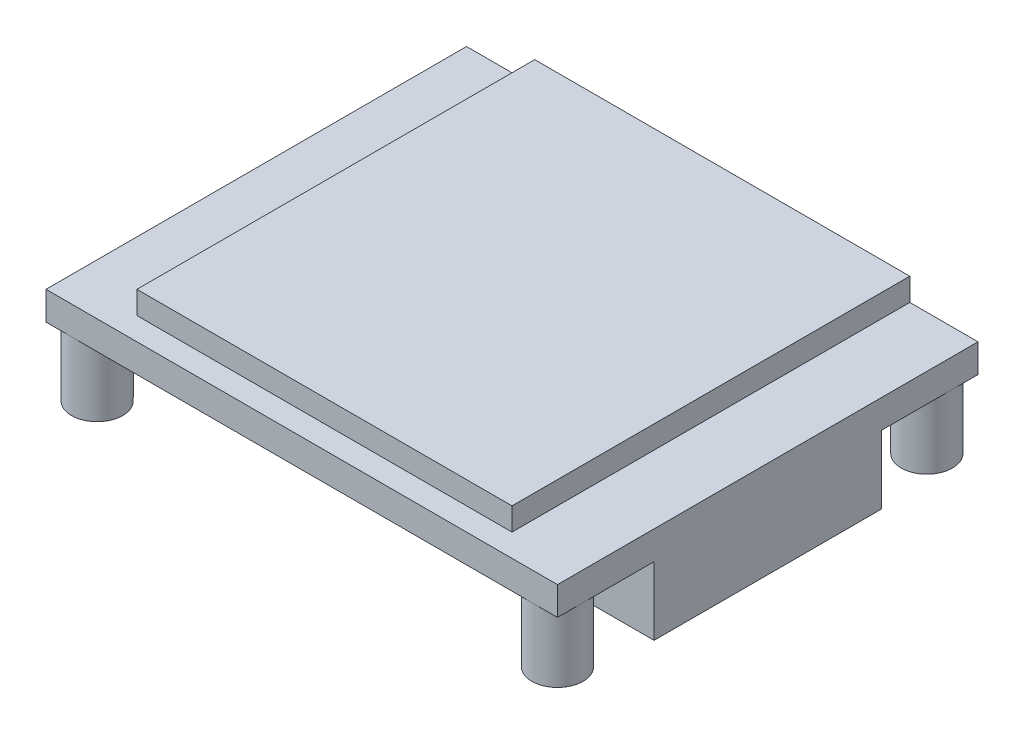
ISO-10303-21;
HEADER;
FILE_DESCRIPTION(('STEP AP214'),'2;1');
FILE_NAME('part.step','',(''),(''),'','','');
FILE_SCHEMA(('AUTOMOTIVE_DESIGN { 1 0 10303 214 1 1 1 1 }'));
ENDSEC;
DATA;
#1=APPLICATION_CONTEXT('core data for automotive mechanical design processes');
#2=APPLICATION_PROTOCOL_DEFINITION('international standard','automotive_design',2000,#1);
#3=PRODUCT_CONTEXT('',#1,'mechanical');
#4=PRODUCT('Part','Part','',(#3));
#5=PRODUCT_RELATED_PRODUCT_CATEGORY('part','',(#4));
#6=PRODUCT_DEFINITION_FORMATION('','',#4);
#7=PRODUCT_DEFINITION_CONTEXT('part definition',#1,'design');
#8=PRODUCT_DEFINITION('design','',#6,#7);
#9=PRODUCT_DEFINITION_SHAPE('','',#8);
#10=(LENGTH_UNIT() NAMED_UNIT(*) SI_UNIT(.MILLI.,.METRE.));
#11=(NAMED_UNIT(*) PLANE_ANGLE_UNIT() SI_UNIT($,.RADIAN.));
#12=(NAMED_UNIT(*) SI_UNIT($,.STERADIAN.) SOLID_ANGLE_UNIT());
#13=UNCERTAINTY_MEASURE_WITH_UNIT(LENGTH_MEASURE(1.E-05),#10,'distance_accuracy_value','');
#14=(GEOMETRIC_REPRESENTATION_CONTEXT(3) GLOBAL_UNCERTAINTY_ASSIGNED_CONTEXT((#13)) GLOBAL_UNIT_ASSIGNED_CONTEXT((#10,
#11,#12)) REPRESENTATION_CONTEXT('',''));
#15=CARTESIAN_POINT('',(0.,0.,0.));
#16=DIRECTION('',(0.,0.,1.));
#17=DIRECTION('',(1.,0.,0.));
#18=AXIS2_PLACEMENT_3D('',#15,#16,#17);
#19=CARTESIAN_POINT('',(0.,0.,0.));
#20=DIRECTION('',(0.,-1.,0.));
#21=DIRECTION('',(0.,0.,-1.));
#22=AXIS2_PLACEMENT_3D('',#19,#20,#21);
#23=PLANE('',#22);
#24=DIRECTION('',(-1.,0.,0.));
#25=VECTOR('',#24,1.);
#26=CARTESIAN_POINT('',(0.,0.,-37.));
#27=LINE('',#26,#25);
#28=CARTESIAN_POINT('',(2.25000000000002,0.,-37.));
#29=VERTEX_POINT('',#28);
#30=CARTESIAN_POINT('',(0.,0.,-37.));
#31=VERTEX_POINT('',#30);
#32=EDGE_CURVE('E156',#29,#31,#27,.T.);
#33=ORIENTED_EDGE('',*,*,#32,.F.);
#34=CARTESIAN_POINT('',(2.25000000000002,0.,-34.75));
#35=DIRECTION('',(0.,-1.,0.));
#36=DIRECTION('',(0.,0.,1.));
#37=AXIS2_PLACEMENT_3D('',#34,#35,#36);
#38=CIRCLE('',#37,2.25);
#39=CARTESIAN_POINT('',(0.,0.,-34.75));
#40=VERTEX_POINT('',#39);
#41=EDGE_CURVE('E49',#40,#29,#38,.T.);
#42=ORIENTED_EDGE('',*,*,#41,.F.);
#43=DIRECTION('',(0.,0.,1.));
#44=VECTOR('',#43,1.);
#45=CARTESIAN_POINT('',(0.,0.,0.));
#46=LINE('',#45,#44);
#47=EDGE_CURVE('E155',#31,#40,#46,.T.);
#48=ORIENTED_EDGE('',*,*,#47,.F.);
#49=EDGE_LOOP('',(#33,#42,#48));
#50=FACE_BOUND('',#49,.T.);
#51=ADVANCED_FACE('F35',(#50),#23,.T.);
#52=CARTESIAN_POINT('',(0.,0.,-2.25000000000002));
#53=VERTEX_POINT('',#52);
#54=CARTESIAN_POINT('',(0.,0.,0.));
#55=VERTEX_POINT('',#54);
#56=EDGE_CURVE('E164',#53,#55,#46,.T.);
#57=ORIENTED_EDGE('',*,*,#56,.F.);
#58=CARTESIAN_POINT('',(2.25000000000002,0.,-2.25000000000002));
#59=DIRECTION('',(0.,-1.,0.));
#60=DIRECTION('',(0.,0.,-1.));
#61=AXIS2_PLACEMENT_3D('',#58,#59,#60);
#62=CIRCLE('',#61,2.25);
#63=CARTESIAN_POINT('',(2.25000000000002,0.,0.));
#64=VERTEX_POINT('',#63);
#65=EDGE_CURVE('E424',#64,#53,#62,.T.);
#66=ORIENTED_EDGE('',*,*,#65,.F.);
#67=DIRECTION('',(1.,0.,0.));
#68=VECTOR('',#67,1.);
#69=CARTESIAN_POINT('',(0.,0.,0.));
#70=LINE('',#69,#68);
#71=EDGE_CURVE('E173',#55,#64,#70,.T.);
#72=ORIENTED_EDGE('',*,*,#71,.F.);
#73=EDGE_LOOP('',(#57,#66,#72));
#74=FACE_BOUND('',#73,.T.);
#75=ADVANCED_FACE('F240',(#74),#23,.T.);
#76=CARTESIAN_POINT('',(42.75,0.,0.));
#77=VERTEX_POINT('',#76);
#78=CARTESIAN_POINT('',(45.,0.,0.));
#79=VERTEX_POINT('',#78);
#80=EDGE_CURVE('E170',#77,#79,#70,.T.);
#81=ORIENTED_EDGE('',*,*,#80,.F.);
#82=CARTESIAN_POINT('',(42.75,0.,-2.25));
#83=DIRECTION('',(0.,-1.,0.));
#84=DIRECTION('',(0.,0.,1.));
#85=AXIS2_PLACEMENT_3D('',#82,#83,#84);
#86=CIRCLE('',#85,2.25);
#87=CARTESIAN_POINT('',(45.,0.,-2.25));
#88=VERTEX_POINT('',#87);
#89=EDGE_CURVE('E418',#88,#77,#86,.T.);
#90=ORIENTED_EDGE('',*,*,#89,.F.);
#91=DIRECTION('',(0.,0.,-1.));
#92=VECTOR('',#91,1.);
#93=CARTESIAN_POINT('',(45.,0.,0.));
#94=LINE('',#93,#92);
#95=EDGE_CURVE('E653',#79,#88,#94,.T.);
#96=ORIENTED_EDGE('',*,*,#95,.F.);
#97=EDGE_LOOP('',(#81,#90,#96));
#98=FACE_BOUND('',#97,.T.);
#99=ADVANCED_FACE('F239',(#98),#23,.T.);
#100=EDGE_CURVE('E57',#40,#53,#46,.T.);
#101=ORIENTED_EDGE('',*,*,#100,.F.);
#102=EDGE_CURVE('E146',#29,#40,#38,.T.);
#103=ORIENTED_EDGE('',*,*,#102,.F.);
#104=CARTESIAN_POINT('',(42.75,0.,-37.));
#105=VERTEX_POINT('',#104);
#106=EDGE_CURVE('E656',#105,#29,#27,.T.);
#107=ORIENTED_EDGE('',*,*,#106,.F.);
#108=CARTESIAN_POINT('',(42.75,0.,-34.75));
#109=DIRECTION('',(0.,-1.,0.));
#110=DIRECTION('',(0.,0.,-1.));
#111=AXIS2_PLACEMENT_3D('',#108,#109,#110);
#112=CIRCLE('',#111,2.25);
#113=CARTESIAN_POINT('',(45.,0.,-34.75));
#114=VERTEX_POINT('',#113);
#115=EDGE_CURVE('E220',#105,#114,#112,.F.);
#116=ORIENTED_EDGE('',*,*,#115,.T.);
#117=CARTESIAN_POINT('',(45.,0.,-28.5));
#118=VERTEX_POINT('',#117);
#119=EDGE_CURVE('E650',#118,#114,#94,.T.);
#120=ORIENTED_EDGE('',*,*,#119,.F.);
#121=DIRECTION('',(1.,0.,0.));
#122=VECTOR('',#121,1.);
#123=CARTESIAN_POINT('',(45.,0.,-28.5));
#124=LINE('',#123,#122);
#125=CARTESIAN_POINT('',(38.,0.,-28.5));
#126=VERTEX_POINT('',#125);
#127=EDGE_CURVE('E390',#126,#118,#124,.T.);
#128=ORIENTED_EDGE('',*,*,#127,.F.);
#129=DIRECTION('',(0.,0.,-1.));
#130=VECTOR('',#129,1.);
#131=CARTESIAN_POINT('',(38.,0.,-28.5));
#132=LINE('',#131,#130);
#133=CARTESIAN_POINT('',(38.,0.,-8.5));
#134=VERTEX_POINT('',#133);
#135=EDGE_CURVE('E394',#134,#126,#132,.T.);
#136=ORIENTED_EDGE('',*,*,#135,.F.);
#137=DIRECTION('',(-1.,0.,0.));
#138=VECTOR('',#137,1.);
#139=CARTESIAN_POINT('',(45.,0.,-8.5));
#140=LINE('',#139,#138);
#141=CARTESIAN_POINT('',(45.,0.,-8.5));
#142=VERTEX_POINT('',#141);
#143=EDGE_CURVE('E397',#142,#134,#140,.T.);
#144=ORIENTED_EDGE('',*,*,#143,.F.);
#145=EDGE_CURVE('E652',#88,#142,#94,.T.);
#146=ORIENTED_EDGE('',*,*,#145,.F.);
#147=EDGE_CURVE('E416',#77,#88,#86,.T.);
#148=ORIENTED_EDGE('',*,*,#147,.F.);
#149=EDGE_CURVE('E171',#64,#77,#70,.T.);
#150=ORIENTED_EDGE('',*,*,#149,.F.);
#151=EDGE_CURVE('E162',#53,#64,#62,.T.);
#152=ORIENTED_EDGE('',*,*,#151,.F.);
#153=EDGE_LOOP('',(#101,#103,#107,#116,#120,#128,#136,#144,#146,#148,#150,#152));
#154=FACE_BOUND('',#153,.T.);
#155=ADVANCED_FACE('F160',(#154),#23,.T.);
#156=CARTESIAN_POINT('',(0.,2.5,0.));
#157=DIRECTION('',(0.,-1.,0.));
#158=DIRECTION('',(0.,0.,-1.));
#159=AXIS2_PLACEMENT_3D('',#156,#157,#158);
#160=PLANE('',#159);
#161=DIRECTION('',(0.,0.,1.));
#162=VECTOR('',#161,1.);
#163=CARTESIAN_POINT('',(6.,2.5,-37.));
#164=LINE('',#163,#162);
#165=CARTESIAN_POINT('',(6.,2.5,-37.));
#166=VERTEX_POINT('',#165);
#167=CARTESIAN_POINT('',(6.,2.5,-2.));
#168=VERTEX_POINT('',#167);
#169=EDGE_CURVE('E206',#166,#168,#164,.T.);
#170=ORIENTED_EDGE('',*,*,#169,.F.);
#171=DIRECTION('',(-1.,0.,0.));
#172=VECTOR('',#171,1.);
#173=CARTESIAN_POINT('',(0.,2.5,-37.));
#174=LINE('',#173,#172);
#175=CARTESIAN_POINT('',(0.,2.5,-37.));
#176=VERTEX_POINT('',#175);
#177=EDGE_CURVE('E197',#166,#176,#174,.T.);
#178=ORIENTED_EDGE('',*,*,#177,.T.);
#179=DIRECTION('',(0.,0.,1.));
#180=VECTOR('',#179,1.);
#181=CARTESIAN_POINT('',(0.,2.5,0.));
#182=LINE('',#181,#180);
#183=CARTESIAN_POINT('',(0.,2.5,0.));
#184=VERTEX_POINT('',#183);
#185=EDGE_CURVE('E190',#176,#184,#182,.T.);
#186=ORIENTED_EDGE('',*,*,#185,.T.);
#187=DIRECTION('',(1.,0.,0.));
#188=VECTOR('',#187,1.);
#189=CARTESIAN_POINT('',(0.,2.5,0.));
#190=LINE('',#189,#188);
#191=CARTESIAN_POINT('',(45.,2.5,0.));
#192=VERTEX_POINT('',#191);
#193=EDGE_CURVE('E193',#184,#192,#190,.T.);
#194=ORIENTED_EDGE('',*,*,#193,.T.);
#195=DIRECTION('',(0.,0.,-1.));
#196=VECTOR('',#195,1.);
#197=CARTESIAN_POINT('',(45.,2.5,0.));
#198=LINE('',#197,#196);
#199=CARTESIAN_POINT('',(45.,2.5,-37.));
#200=VERTEX_POINT('',#199);
#201=EDGE_CURVE('E196',#192,#200,#198,.T.);
#202=ORIENTED_EDGE('',*,*,#201,.T.);
#203=CARTESIAN_POINT('',(39.,2.5,-37.));
#204=VERTEX_POINT('',#203);
#205=EDGE_CURVE('E198',#200,#204,#174,.T.);
#206=ORIENTED_EDGE('',*,*,#205,.T.);
#207=DIRECTION('',(0.,0.,-1.));
#208=VECTOR('',#207,1.);
#209=CARTESIAN_POINT('',(39.,2.5,-37.));
#210=LINE('',#209,#208);
#211=CARTESIAN_POINT('',(39.,2.5,-2.));
#212=VERTEX_POINT('',#211);
#213=EDGE_CURVE('E356',#212,#204,#210,.T.);
#214=ORIENTED_EDGE('',*,*,#213,.F.);
#215=DIRECTION('',(1.,0.,0.));
#216=VECTOR('',#215,1.);
#217=CARTESIAN_POINT('',(6.,2.5,-2.));
#218=LINE('',#217,#216);
#219=EDGE_CURVE('E354',#168,#212,#218,.T.);
#220=ORIENTED_EDGE('',*,*,#219,.F.);
#221=EDGE_LOOP('',(#170,#178,#186,#194,#202,#206,#214,#220));
#222=FACE_BOUND('',#221,.T.);
#223=ADVANCED_FACE('F205',(#222),#160,.F.);
#224=CARTESIAN_POINT('',(0.,2.5,0.));
#225=DIRECTION('',(1.,0.,0.));
#226=DIRECTION('',(0.,0.,-1.));
#227=AXIS2_PLACEMENT_3D('',#224,#225,#226);
#228=PLANE('',#227);
#229=ORIENTED_EDGE('',*,*,#47,.T.);
#230=ORIENTED_EDGE('',*,*,#100,.T.);
#231=ORIENTED_EDGE('',*,*,#56,.T.);
#232=DIRECTION('',(0.,-1.,0.));
#233=VECTOR('',#232,1.);
#234=CARTESIAN_POINT('',(0.,2.5,0.));
#235=LINE('',#234,#233);
#236=EDGE_CURVE('E213',#184,#55,#235,.T.);
#237=ORIENTED_EDGE('',*,*,#236,.F.);
#238=ORIENTED_EDGE('',*,*,#185,.F.);
#239=DIRECTION('',(0.,-1.,0.));
#240=VECTOR('',#239,1.);
#241=CARTESIAN_POINT('',(0.,2.5,-37.));
#242=LINE('',#241,#240);
#243=EDGE_CURVE('E169',#176,#31,#242,.T.);
#244=ORIENTED_EDGE('',*,*,#243,.T.);
#245=EDGE_LOOP('',(#229,#230,#231,#237,#238,#244));
#246=FACE_BOUND('',#245,.T.);
#247=ADVANCED_FACE('F37',(#246),#228,.F.);
#248=CARTESIAN_POINT('',(0.,2.5,0.));
#249=DIRECTION('',(0.,0.,-1.));
#250=DIRECTION('',(-1.,0.,0.));
#251=AXIS2_PLACEMENT_3D('',#248,#249,#250);
#252=PLANE('',#251);
#253=ORIENTED_EDGE('',*,*,#71,.T.);
#254=ORIENTED_EDGE('',*,*,#149,.T.);
#255=ORIENTED_EDGE('',*,*,#80,.T.);
#256=DIRECTION('',(0.,-1.,0.));
#257=VECTOR('',#256,1.);
#258=CARTESIAN_POINT('',(45.,2.5,0.));
#259=LINE('',#258,#257);
#260=EDGE_CURVE('E217',#192,#79,#259,.T.);
#261=ORIENTED_EDGE('',*,*,#260,.F.);
#262=ORIENTED_EDGE('',*,*,#193,.F.);
#263=ORIENTED_EDGE('',*,*,#236,.T.);
#264=EDGE_LOOP('',(#253,#254,#255,#261,#262,#263));
#265=FACE_BOUND('',#264,.T.);
#266=ADVANCED_FACE('F569',(#265),#252,.F.);
#267=CARTESIAN_POINT('',(45.,2.5,0.));
#268=DIRECTION('',(-1.,0.,0.));
#269=DIRECTION('',(0.,0.,1.));
#270=AXIS2_PLACEMENT_3D('',#267,#268,#269);
#271=PLANE('',#270);
#272=ORIENTED_EDGE('',*,*,#95,.T.);
#273=ORIENTED_EDGE('',*,*,#145,.T.);
#274=DIRECTION('',(0.,1.,0.));
#275=VECTOR('',#274,1.);
#276=CARTESIAN_POINT('',(45.,-6.,-8.5));
#277=LINE('',#276,#275);
#278=CARTESIAN_POINT('',(45.,-6.,-8.5));
#279=VERTEX_POINT('',#278);
#280=EDGE_CURVE('E371',#279,#142,#277,.T.);
#281=ORIENTED_EDGE('',*,*,#280,.F.);
#282=DIRECTION('',(0.,0.,1.));
#283=VECTOR('',#282,1.);
#284=CARTESIAN_POINT('',(45.,-6.,-28.5));
#285=LINE('',#284,#283);
#286=CARTESIAN_POINT('',(45.,-6.,-28.5));
#287=VERTEX_POINT('',#286);
#288=EDGE_CURVE('E393',#287,#279,#285,.T.);
#289=ORIENTED_EDGE('',*,*,#288,.F.);
#290=DIRECTION('',(0.,1.,0.));
#291=VECTOR('',#290,1.);
#292=CARTESIAN_POINT('',(45.,-6.,-28.5));
#293=LINE('',#292,#291);
#294=EDGE_CURVE('E386',#287,#118,#293,.T.);
#295=ORIENTED_EDGE('',*,*,#294,.T.);
#296=ORIENTED_EDGE('',*,*,#119,.T.);
#297=CARTESIAN_POINT('',(45.,0.,-37.));
#298=VERTEX_POINT('',#297);
#299=EDGE_CURVE('E649',#114,#298,#94,.T.);
#300=ORIENTED_EDGE('',*,*,#299,.T.);
#301=DIRECTION('',(0.,-1.,0.));
#302=VECTOR('',#301,1.);
#303=CARTESIAN_POINT('',(45.,2.5,-37.));
#304=LINE('',#303,#302);
#305=EDGE_CURVE('E202',#200,#298,#304,.T.);
#306=ORIENTED_EDGE('',*,*,#305,.F.);
#307=ORIENTED_EDGE('',*,*,#201,.F.);
#308=ORIENTED_EDGE('',*,*,#260,.T.);
#309=EDGE_LOOP('',(#272,#273,#281,#289,#295,#296,#300,#306,#307,#308));
#310=FACE_BOUND('',#309,.T.);
#311=ADVANCED_FACE('F276',(#310),#271,.F.);
#312=CARTESIAN_POINT('',(0.,2.5,-37.));
#313=DIRECTION('',(0.,0.,1.));
#314=DIRECTION('',(1.,0.,0.));
#315=AXIS2_PLACEMENT_3D('',#312,#313,#314);
#316=PLANE('',#315);
#317=EDGE_CURVE('E194',#298,#105,#27,.T.);
#318=ORIENTED_EDGE('',*,*,#317,.T.);
#319=ORIENTED_EDGE('',*,*,#106,.T.);
#320=ORIENTED_EDGE('',*,*,#32,.T.);
#321=ORIENTED_EDGE('',*,*,#243,.F.);
#322=ORIENTED_EDGE('',*,*,#177,.F.);
#323=DIRECTION('',(0.,-1.,0.));
#324=VECTOR('',#323,1.);
#325=CARTESIAN_POINT('',(6.,4.5,-37.));
#326=LINE('',#325,#324);
#327=CARTESIAN_POINT('',(6.,4.5,-37.));
#328=VERTEX_POINT('',#327);
#329=EDGE_CURVE('E365',#328,#166,#326,.T.);
#330=ORIENTED_EDGE('',*,*,#329,.F.);
#331=DIRECTION('',(-1.,0.,0.));
#332=VECTOR('',#331,1.);
#333=CARTESIAN_POINT('',(6.,4.5,-37.));
#334=LINE('',#333,#332);
#335=CARTESIAN_POINT('',(39.,4.5,-37.));
#336=VERTEX_POINT('',#335);
#337=EDGE_CURVE('E362',#336,#328,#334,.T.);
#338=ORIENTED_EDGE('',*,*,#337,.F.);
#339=DIRECTION('',(0.,-1.,0.));
#340=VECTOR('',#339,1.);
#341=CARTESIAN_POINT('',(39.,4.5,-37.));
#342=LINE('',#341,#340);
#343=EDGE_CURVE('E186',#336,#204,#342,.T.);
#344=ORIENTED_EDGE('',*,*,#343,.T.);
#345=ORIENTED_EDGE('',*,*,#205,.F.);
#346=ORIENTED_EDGE('',*,*,#305,.T.);
#347=EDGE_LOOP('',(#318,#319,#320,#321,#322,#330,#338,#344,#345,#346));
#348=FACE_BOUND('',#347,.T.);
#349=ADVANCED_FACE('F211',(#348),#316,.F.);
#350=ORIENTED_EDGE('',*,*,#299,.F.);
#351=CARTESIAN_POINT('',(42.75,0.,-34.75));
#352=DIRECTION('',(0.,-1.,0.));
#353=DIRECTION('',(0.,0.,-1.));
#354=AXIS2_PLACEMENT_3D('',#351,#352,#353);
#355=CIRCLE('',#354,2.25);
#356=EDGE_CURVE('E408',#105,#114,#355,.T.);
#357=ORIENTED_EDGE('',*,*,#356,.F.);
#358=ORIENTED_EDGE('',*,*,#317,.F.);
#359=EDGE_LOOP('',(#350,#357,#358));
#360=FACE_BOUND('',#359,.T.);
#361=ADVANCED_FACE('F250',(#360),#23,.T.);
#362=CARTESIAN_POINT('',(6.,4.5,-37.));
#363=DIRECTION('',(1.,0.,0.));
#364=DIRECTION('',(0.,0.,-1.));
#365=AXIS2_PLACEMENT_3D('',#362,#363,#364);
#366=PLANE('',#365);
#367=ORIENTED_EDGE('',*,*,#169,.T.);
#368=DIRECTION('',(0.,-1.,0.));
#369=VECTOR('',#368,1.);
#370=CARTESIAN_POINT('',(6.,4.5,-2.));
#371=LINE('',#370,#369);
#372=CARTESIAN_POINT('',(6.,4.5,-2.));
#373=VERTEX_POINT('',#372);
#374=EDGE_CURVE('E175',#373,#168,#371,.T.);
#375=ORIENTED_EDGE('',*,*,#374,.F.);
#376=DIRECTION('',(0.,0.,1.));
#377=VECTOR('',#376,1.);
#378=CARTESIAN_POINT('',(6.,4.5,-37.));
#379=LINE('',#378,#377);
#380=EDGE_CURVE('E367',#328,#373,#379,.T.);
#381=ORIENTED_EDGE('',*,*,#380,.F.);
#382=ORIENTED_EDGE('',*,*,#329,.T.);
#383=EDGE_LOOP('',(#367,#375,#381,#382));
#384=FACE_BOUND('',#383,.T.);
#385=ADVANCED_FACE('F266',(#384),#366,.F.);
#386=CARTESIAN_POINT('',(6.,4.5,-2.));
#387=DIRECTION('',(0.,0.,-1.));
#388=DIRECTION('',(-1.,0.,0.));
#389=AXIS2_PLACEMENT_3D('',#386,#387,#388);
#390=PLANE('',#389);
#391=ORIENTED_EDGE('',*,*,#219,.T.);
#392=DIRECTION('',(0.,-1.,0.));
#393=VECTOR('',#392,1.);
#394=CARTESIAN_POINT('',(39.,4.5,-2.));
#395=LINE('',#394,#393);
#396=CARTESIAN_POINT('',(39.,4.5,-2.));
#397=VERTEX_POINT('',#396);
#398=EDGE_CURVE('E179',#397,#212,#395,.T.);
#399=ORIENTED_EDGE('',*,*,#398,.F.);
#400=DIRECTION('',(1.,0.,0.));
#401=VECTOR('',#400,1.);
#402=CARTESIAN_POINT('',(6.,4.5,-2.));
#403=LINE('',#402,#401);
#404=EDGE_CURVE('E363',#373,#397,#403,.T.);
#405=ORIENTED_EDGE('',*,*,#404,.F.);
#406=ORIENTED_EDGE('',*,*,#374,.T.);
#407=EDGE_LOOP('',(#391,#399,#405,#406));
#408=FACE_BOUND('',#407,.T.);
#409=ADVANCED_FACE('F273',(#408),#390,.F.);
#410=CARTESIAN_POINT('',(39.,4.5,-37.));
#411=DIRECTION('',(-1.,0.,0.));
#412=DIRECTION('',(0.,0.,1.));
#413=AXIS2_PLACEMENT_3D('',#410,#411,#412);
#414=PLANE('',#413);
#415=ORIENTED_EDGE('',*,*,#213,.T.);
#416=ORIENTED_EDGE('',*,*,#343,.F.);
#417=DIRECTION('',(0.,0.,-1.));
#418=VECTOR('',#417,1.);
#419=CARTESIAN_POINT('',(39.,4.5,-37.));
#420=LINE('',#419,#418);
#421=EDGE_CURVE('E360',#397,#336,#420,.T.);
#422=ORIENTED_EDGE('',*,*,#421,.F.);
#423=ORIENTED_EDGE('',*,*,#398,.T.);
#424=EDGE_LOOP('',(#415,#416,#422,#423));
#425=FACE_BOUND('',#424,.T.);
#426=ADVANCED_FACE('F345',(#425),#414,.F.);
#427=CARTESIAN_POINT('',(0.,4.5,0.));
#428=DIRECTION('',(0.,1.,0.));
#429=DIRECTION('',(0.,0.,1.));
#430=AXIS2_PLACEMENT_3D('',#427,#428,#429);
#431=PLANE('',#430);
#432=ORIENTED_EDGE('',*,*,#380,.T.);
#433=ORIENTED_EDGE('',*,*,#404,.T.);
#434=ORIENTED_EDGE('',*,*,#421,.T.);
#435=ORIENTED_EDGE('',*,*,#337,.T.);
#436=EDGE_LOOP('',(#432,#433,#434,#435));
#437=FACE_BOUND('',#436,.T.);
#438=ADVANCED_FACE('F341',(#437),#431,.T.);
#439=CARTESIAN_POINT('',(45.,-6.,-8.5));
#440=DIRECTION('',(0.,0.,-1.));
#441=DIRECTION('',(-1.,0.,0.));
#442=AXIS2_PLACEMENT_3D('',#439,#440,#441);
#443=PLANE('',#442);
#444=ORIENTED_EDGE('',*,*,#143,.T.);
#445=DIRECTION('',(0.,1.,0.));
#446=VECTOR('',#445,1.);
#447=CARTESIAN_POINT('',(38.,-6.,-8.5));
#448=LINE('',#447,#446);
#449=CARTESIAN_POINT('',(38.,-6.,-8.5));
#450=VERTEX_POINT('',#449);
#451=EDGE_CURVE('E380',#450,#134,#448,.T.);
#452=ORIENTED_EDGE('',*,*,#451,.F.);
#453=DIRECTION('',(-1.,0.,0.));
#454=VECTOR('',#453,1.);
#455=CARTESIAN_POINT('',(45.,-6.,-8.5));
#456=LINE('',#455,#454);
#457=EDGE_CURVE('E404',#279,#450,#456,.T.);
#458=ORIENTED_EDGE('',*,*,#457,.F.);
#459=ORIENTED_EDGE('',*,*,#280,.T.);
#460=EDGE_LOOP('',(#444,#452,#458,#459));
#461=FACE_BOUND('',#460,.T.);
#462=ADVANCED_FACE('F337',(#461),#443,.F.);
#463=CARTESIAN_POINT('',(38.,-6.,-28.5));
#464=DIRECTION('',(1.,0.,0.));
#465=DIRECTION('',(0.,0.,-1.));
#466=AXIS2_PLACEMENT_3D('',#463,#464,#465);
#467=PLANE('',#466);
#468=ORIENTED_EDGE('',*,*,#135,.T.);
#469=DIRECTION('',(0.,1.,0.));
#470=VECTOR('',#469,1.);
#471=CARTESIAN_POINT('',(38.,-6.,-28.5));
#472=LINE('',#471,#470);
#473=CARTESIAN_POINT('',(38.,-6.,-28.5));
#474=VERTEX_POINT('',#473);
#475=EDGE_CURVE('E383',#474,#126,#472,.T.);
#476=ORIENTED_EDGE('',*,*,#475,.F.);
#477=DIRECTION('',(0.,0.,-1.));
#478=VECTOR('',#477,1.);
#479=CARTESIAN_POINT('',(38.,-6.,-28.5));
#480=LINE('',#479,#478);
#481=EDGE_CURVE('E402',#450,#474,#480,.T.);
#482=ORIENTED_EDGE('',*,*,#481,.F.);
#483=ORIENTED_EDGE('',*,*,#451,.T.);
#484=EDGE_LOOP('',(#468,#476,#482,#483));
#485=FACE_BOUND('',#484,.T.);
#486=ADVANCED_FACE('F333',(#485),#467,.F.);
#487=CARTESIAN_POINT('',(45.,-6.,-28.5));
#488=DIRECTION('',(0.,0.,1.));
#489=DIRECTION('',(1.,0.,0.));
#490=AXIS2_PLACEMENT_3D('',#487,#488,#489);
#491=PLANE('',#490);
#492=ORIENTED_EDGE('',*,*,#127,.T.);
#493=ORIENTED_EDGE('',*,*,#294,.F.);
#494=DIRECTION('',(1.,0.,0.));
#495=VECTOR('',#494,1.);
#496=CARTESIAN_POINT('',(45.,-6.,-28.5));
#497=LINE('',#496,#495);
#498=EDGE_CURVE('E389',#474,#287,#497,.T.);
#499=ORIENTED_EDGE('',*,*,#498,.F.);
#500=ORIENTED_EDGE('',*,*,#475,.T.);
#501=EDGE_LOOP('',(#492,#493,#499,#500));
#502=FACE_BOUND('',#501,.T.);
#503=ADVANCED_FACE('F329',(#502),#491,.F.);
#504=CARTESIAN_POINT('',(0.,-6.,0.));
#505=DIRECTION('',(0.,-1.,0.));
#506=DIRECTION('',(0.,0.,-1.));
#507=AXIS2_PLACEMENT_3D('',#504,#505,#506);
#508=PLANE('',#507);
#509=ORIENTED_EDGE('',*,*,#288,.T.);
#510=ORIENTED_EDGE('',*,*,#457,.T.);
#511=ORIENTED_EDGE('',*,*,#481,.T.);
#512=ORIENTED_EDGE('',*,*,#498,.T.);
#513=EDGE_LOOP('',(#509,#510,#511,#512));
#514=FACE_BOUND('',#513,.T.);
#515=ADVANCED_FACE('F322',(#514),#508,.T.);
#516=CARTESIAN_POINT('',(42.75,-6.,-34.75));
#517=DIRECTION('',(0.,-1.,0.));
#518=DIRECTION('',(0.,0.,-1.));
#519=AXIS2_PLACEMENT_3D('',#516,#517,#518);
#520=PLANE('',#519);
#521=CARTESIAN_POINT('',(42.75,-6.,-34.75));
#522=DIRECTION('',(0.,-1.,0.));
#523=DIRECTION('',(0.,0.,-1.));
#524=AXIS2_PLACEMENT_3D('',#521,#522,#523);
#525=CIRCLE('',#524,2.25);
#526=CARTESIAN_POINT('',(42.75,-6.,-37.));
#527=VERTEX_POINT('',#526);
#528=EDGE_CURVE('E400',#527,#527,#525,.T.);
#529=ORIENTED_EDGE('',*,*,#528,.T.);
#530=EDGE_LOOP('',(#529));
#531=FACE_BOUND('',#530,.T.);
#532=CARTESIAN_POINT('',(42.75,-6.,-34.75));
#533=DIRECTION('',(0.,-1.,0.));
#534=DIRECTION('',(0.,0.,-1.));
#535=AXIS2_PLACEMENT_3D('',#532,#533,#534);
#536=CIRCLE('',#535,1.5);
#537=CARTESIAN_POINT('',(42.75,-6.,-36.25));
#538=VERTEX_POINT('',#537);
#539=EDGE_CURVE('E410',#538,#538,#536,.T.);
#540=ORIENTED_EDGE('',*,*,#539,.F.);
#541=EDGE_LOOP('',(#540));
#542=FACE_BOUND('',#541,.T.);
#543=ADVANCED_FACE('F319',(#531,#542),#520,.T.);
#544=CARTESIAN_POINT('',(42.75,-6.,-34.75));
#545=DIRECTION('',(0.,1.,0.));
#546=DIRECTION('',(0.,0.,1.));
#547=AXIS2_PLACEMENT_3D('',#544,#545,#546);
#548=CYLINDRICAL_SURFACE('',#547,2.25);
#549=ORIENTED_EDGE('',*,*,#528,.F.);
#550=EDGE_LOOP('',(#549));
#551=FACE_BOUND('',#550,.T.);
#552=ORIENTED_EDGE('',*,*,#356,.T.);
#553=ORIENTED_EDGE('',*,*,#115,.F.);
#554=EDGE_LOOP('',(#552,#553));
#555=FACE_BOUND('',#554,.T.);
#556=ADVANCED_FACE('F289',(#551,#555),#548,.T.);
#557=CARTESIAN_POINT('',(42.75,-6.,-34.75));
#558=DIRECTION('',(0.,1.,0.));
#559=DIRECTION('',(0.,0.,1.));
#560=AXIS2_PLACEMENT_3D('',#557,#558,#559);
#561=CYLINDRICAL_SURFACE('',#560,1.5);
#562=ORIENTED_EDGE('',*,*,#539,.T.);
#563=EDGE_LOOP('',(#562));
#564=FACE_BOUND('',#563,.T.);
#565=CARTESIAN_POINT('',(42.75,0.,-34.75));
#566=DIRECTION('',(0.,-1.,0.));
#567=DIRECTION('',(0.,0.,-1.));
#568=AXIS2_PLACEMENT_3D('',#565,#566,#567);
#569=CIRCLE('',#568,1.5);
#570=CARTESIAN_POINT('',(42.75,0.,-36.25));
#571=VERTEX_POINT('',#570);
#572=EDGE_CURVE('E216',#571,#571,#569,.F.);
#573=ORIENTED_EDGE('',*,*,#572,.T.);
#574=EDGE_LOOP('',(#573));
#575=FACE_BOUND('',#574,.T.);
#576=ADVANCED_FACE('F280',(#564,#575),#561,.F.);
#577=ORIENTED_EDGE('',*,*,#572,.F.);
#578=EDGE_LOOP('',(#577));
#579=FACE_BOUND('',#578,.T.);
#580=ADVANCED_FACE('F268',(#579),#23,.T.);
#581=CARTESIAN_POINT('',(42.75,-6.,-2.25));
#582=DIRECTION('',(0.,1.,0.));
#583=DIRECTION('',(0.,0.,1.));
#584=AXIS2_PLACEMENT_3D('',#581,#582,#583);
#585=PLANE('',#584);
#586=CARTESIAN_POINT('',(42.75,-6.,-2.25));
#587=DIRECTION('',(0.,-1.,0.));
#588=DIRECTION('',(0.,0.,1.));
#589=AXIS2_PLACEMENT_3D('',#586,#587,#588);
#590=CIRCLE('',#589,2.25);
#591=CARTESIAN_POINT('',(42.75,-6.,0.));
#592=VERTEX_POINT('',#591);
#593=EDGE_CURVE('E415',#592,#592,#590,.T.);
#594=ORIENTED_EDGE('',*,*,#593,.T.);
#595=EDGE_LOOP('',(#594));
#596=FACE_BOUND('',#595,.T.);
#597=CARTESIAN_POINT('',(42.75,-6.,-2.25));
#598=DIRECTION('',(0.,-1.,0.));
#599=DIRECTION('',(0.,0.,1.));
#600=AXIS2_PLACEMENT_3D('',#597,#598,#599);
#601=CIRCLE('',#600,1.5);
#602=CARTESIAN_POINT('',(42.75,-6.,-0.749999999999998));
#603=VERTEX_POINT('',#602);
#604=EDGE_CURVE('E421',#603,#603,#601,.T.);
#605=ORIENTED_EDGE('',*,*,#604,.F.);
#606=EDGE_LOOP('',(#605));
#607=FACE_BOUND('',#606,.T.);
#608=ADVANCED_FACE('F279',(#596,#607),#585,.F.);
#609=CARTESIAN_POINT('',(42.75,-6.,-2.25));
#610=DIRECTION('',(0.,1.,0.));
#611=DIRECTION('',(0.,0.,1.));
#612=AXIS2_PLACEMENT_3D('',#609,#610,#611);
#613=CYLINDRICAL_SURFACE('',#612,2.25);
#614=ORIENTED_EDGE('',*,*,#593,.F.);
#615=EDGE_LOOP('',(#614));
#616=FACE_BOUND('',#615,.T.);
#617=ORIENTED_EDGE('',*,*,#147,.T.);
#618=ORIENTED_EDGE('',*,*,#89,.T.);
#619=EDGE_LOOP('',(#617,#618));
#620=FACE_BOUND('',#619,.T.);
#621=ADVANCED_FACE('F286',(#616,#620),#613,.T.);
#622=CARTESIAN_POINT('',(42.75,-6.,-2.25));
#623=DIRECTION('',(0.,1.,0.));
#624=DIRECTION('',(0.,0.,1.));
#625=AXIS2_PLACEMENT_3D('',#622,#623,#624);
#626=CYLINDRICAL_SURFACE('',#625,1.5);
#627=ORIENTED_EDGE('',*,*,#604,.T.);
#628=EDGE_LOOP('',(#627));
#629=FACE_BOUND('',#628,.T.);
#630=CARTESIAN_POINT('',(42.75,0.,-2.25));
#631=DIRECTION('',(0.,-1.,0.));
#632=DIRECTION('',(0.,0.,-1.));
#633=AXIS2_PLACEMENT_3D('',#630,#631,#632);
#634=CIRCLE('',#633,1.5);
#635=CARTESIAN_POINT('',(42.75,0.,-3.75000000000001));
#636=VERTEX_POINT('',#635);
#637=EDGE_CURVE('E228',#636,#636,#634,.F.);
#638=ORIENTED_EDGE('',*,*,#637,.T.);
#639=EDGE_LOOP('',(#638));
#640=FACE_BOUND('',#639,.T.);
#641=ADVANCED_FACE('F299',(#629,#640),#626,.F.);
#642=ORIENTED_EDGE('',*,*,#637,.F.);
#643=EDGE_LOOP('',(#642));
#644=FACE_BOUND('',#643,.T.);
#645=ADVANCED_FACE('F255',(#644),#23,.T.);
#646=CARTESIAN_POINT('',(2.25000000000002,-6.,-2.25000000000002));
#647=DIRECTION('',(0.,-1.,0.));
#648=DIRECTION('',(0.,0.,-1.));
#649=AXIS2_PLACEMENT_3D('',#646,#647,#648);
#650=PLANE('',#649);
#651=CARTESIAN_POINT('',(2.25000000000002,-6.,-2.25000000000002));
#652=DIRECTION('',(0.,-1.,0.));
#653=DIRECTION('',(0.,0.,-1.));
#654=AXIS2_PLACEMENT_3D('',#651,#652,#653);
#655=CIRCLE('',#654,2.25);
#656=CARTESIAN_POINT('',(2.25000000000002,-6.,-4.50000000000002));
#657=VERTEX_POINT('',#656);
#658=EDGE_CURVE('E423',#657,#657,#655,.T.);
#659=ORIENTED_EDGE('',*,*,#658,.T.);
#660=EDGE_LOOP('',(#659));
#661=FACE_BOUND('',#660,.T.);
#662=CARTESIAN_POINT('',(2.25000000000002,-6.,-2.25000000000002));
#663=DIRECTION('',(0.,-1.,0.));
#664=DIRECTION('',(0.,0.,-1.));
#665=AXIS2_PLACEMENT_3D('',#662,#663,#664);
#666=CIRCLE('',#665,1.5);
#667=CARTESIAN_POINT('',(2.25000000000002,-6.,-3.75000000000002));
#668=VERTEX_POINT('',#667);
#669=EDGE_CURVE('E428',#668,#668,#666,.T.);
#670=ORIENTED_EDGE('',*,*,#669,.F.);
#671=EDGE_LOOP('',(#670));
#672=FACE_BOUND('',#671,.T.);
#673=ADVANCED_FACE('F298',(#661,#672),#650,.T.);
#674=CARTESIAN_POINT('',(2.25000000000002,-6.,-2.25000000000002));
#675=DIRECTION('',(0.,1.,0.));
#676=DIRECTION('',(0.,0.,1.));
#677=AXIS2_PLACEMENT_3D('',#674,#675,#676);
#678=CYLINDRICAL_SURFACE('',#677,2.25);
#679=ORIENTED_EDGE('',*,*,#658,.F.);
#680=EDGE_LOOP('',(#679));
#681=FACE_BOUND('',#680,.T.);
#682=ORIENTED_EDGE('',*,*,#65,.T.);
#683=ORIENTED_EDGE('',*,*,#151,.T.);
#684=EDGE_LOOP('',(#682,#683));
#685=FACE_BOUND('',#684,.T.);
#686=ADVANCED_FACE('F247',(#681,#685),#678,.T.);
#687=CARTESIAN_POINT('',(2.25000000000002,-6.,-2.25000000000002));
#688=DIRECTION('',(0.,1.,0.));
#689=DIRECTION('',(0.,0.,1.));
#690=AXIS2_PLACEMENT_3D('',#687,#688,#689);
#691=CYLINDRICAL_SURFACE('',#690,1.5);
#692=ORIENTED_EDGE('',*,*,#669,.T.);
#693=EDGE_LOOP('',(#692));
#694=FACE_BOUND('',#693,.T.);
#695=CARTESIAN_POINT('',(2.25000000000002,0.,-2.25000000000002));
#696=DIRECTION('',(0.,-1.,0.));
#697=DIRECTION('',(0.,0.,-1.));
#698=AXIS2_PLACEMENT_3D('',#695,#696,#697);
#699=CIRCLE('',#698,1.5);
#700=CARTESIAN_POINT('',(2.25000000000002,0.,-3.75000000000002));
#701=VERTEX_POINT('',#700);
#702=EDGE_CURVE('E43',#701,#701,#699,.F.);
#703=ORIENTED_EDGE('',*,*,#702,.T.);
#704=EDGE_LOOP('',(#703));
#705=FACE_BOUND('',#704,.T.);
#706=ADVANCED_FACE('F233',(#694,#705),#691,.F.);
#707=ORIENTED_EDGE('',*,*,#702,.F.);
#708=EDGE_LOOP('',(#707));
#709=FACE_BOUND('',#708,.T.);
#710=ADVANCED_FACE('F235',(#709),#23,.T.);
#711=CARTESIAN_POINT('',(2.25000000000002,-6.,-34.75));
#712=DIRECTION('',(0.,1.,0.));
#713=DIRECTION('',(0.,0.,1.));
#714=AXIS2_PLACEMENT_3D('',#711,#712,#713);
#715=PLANE('',#714);
#716=CARTESIAN_POINT('',(2.25000000000002,-6.,-34.75));
#717=DIRECTION('',(0.,-1.,0.));
#718=DIRECTION('',(0.,0.,1.));
#719=AXIS2_PLACEMENT_3D('',#716,#717,#718);
#720=CIRCLE('',#719,2.25);
#721=CARTESIAN_POINT('',(2.25000000000002,-6.,-32.5));
#722=VERTEX_POINT('',#721);
#723=EDGE_CURVE('E158',#722,#722,#720,.T.);
#724=ORIENTED_EDGE('',*,*,#723,.T.);
#725=EDGE_LOOP('',(#724));
#726=FACE_BOUND('',#725,.T.);
#727=CARTESIAN_POINT('',(2.25000000000002,-6.,-34.75));
#728=DIRECTION('',(0.,-1.,0.));
#729=DIRECTION('',(0.,0.,1.));
#730=AXIS2_PLACEMENT_3D('',#727,#728,#729);
#731=CIRCLE('',#730,1.5);
#732=CARTESIAN_POINT('',(2.25000000000002,-6.,-33.25));
#733=VERTEX_POINT('',#732);
#734=EDGE_CURVE('E151',#733,#733,#731,.T.);
#735=ORIENTED_EDGE('',*,*,#734,.F.);
#736=EDGE_LOOP('',(#735));
#737=FACE_BOUND('',#736,.T.);
#738=ADVANCED_FACE('F237',(#726,#737),#715,.F.);
#739=CARTESIAN_POINT('',(2.25000000000002,-6.,-34.75));
#740=DIRECTION('',(0.,1.,0.));
#741=DIRECTION('',(0.,0.,1.));
#742=AXIS2_PLACEMENT_3D('',#739,#740,#741);
#743=CYLINDRICAL_SURFACE('',#742,2.25);
#744=ORIENTED_EDGE('',*,*,#723,.F.);
#745=EDGE_LOOP('',(#744));
#746=FACE_BOUND('',#745,.T.);
#747=ORIENTED_EDGE('',*,*,#41,.T.);
#748=ORIENTED_EDGE('',*,*,#102,.T.);
#749=EDGE_LOOP('',(#747,#748));
#750=FACE_BOUND('',#749,.T.);
#751=ADVANCED_FACE('F147',(#746,#750),#743,.T.);
#752=CARTESIAN_POINT('',(2.25000000000002,-6.,-34.75));
#753=DIRECTION('',(0.,1.,0.));
#754=DIRECTION('',(0.,0.,1.));
#755=AXIS2_PLACEMENT_3D('',#752,#753,#754);
#756=CYLINDRICAL_SURFACE('',#755,1.5);
#757=ORIENTED_EDGE('',*,*,#734,.T.);
#758=EDGE_LOOP('',(#757));
#759=FACE_BOUND('',#758,.T.);
#760=CARTESIAN_POINT('',(2.25000000000002,0.,-34.75));
#761=DIRECTION('',(0.,-1.,0.));
#762=DIRECTION('',(0.,0.,-1.));
#763=AXIS2_PLACEMENT_3D('',#760,#761,#762);
#764=CIRCLE('',#763,1.5);
#765=CARTESIAN_POINT('',(2.25000000000002,0.,-36.25));
#766=VERTEX_POINT('',#765);
#767=EDGE_CURVE('E11',#766,#766,#764,.F.);
#768=ORIENTED_EDGE('',*,*,#767,.T.);
#769=EDGE_LOOP('',(#768));
#770=FACE_BOUND('',#769,.T.);
#771=ADVANCED_FACE('F263',(#759,#770),#756,.F.);
#772=ORIENTED_EDGE('',*,*,#767,.F.);
#773=EDGE_LOOP('',(#772));
#774=FACE_BOUND('',#773,.T.);
#775=ADVANCED_FACE('F258',(#774),#23,.T.);
#776=CLOSED_SHELL('',(#51,#75,#99,#155,#223,#247,#266,#311,#349,#361,#385,#409,#426,#438,#462,
#486,#503,#515,#543,#556,#576,#580,#608,#621,#641,#645,#673,#686,#706,#710,#738,#751,#771,#775));
#777=MANIFOLD_SOLID_BREP('B2',#776);
#778=ADVANCED_BREP_SHAPE_REPRESENTATION('',(#18,#777),#14);
#779=SHAPE_DEFINITION_REPRESENTATION(#9,#778);
ENDSEC;
END-ISO-10303-21;
